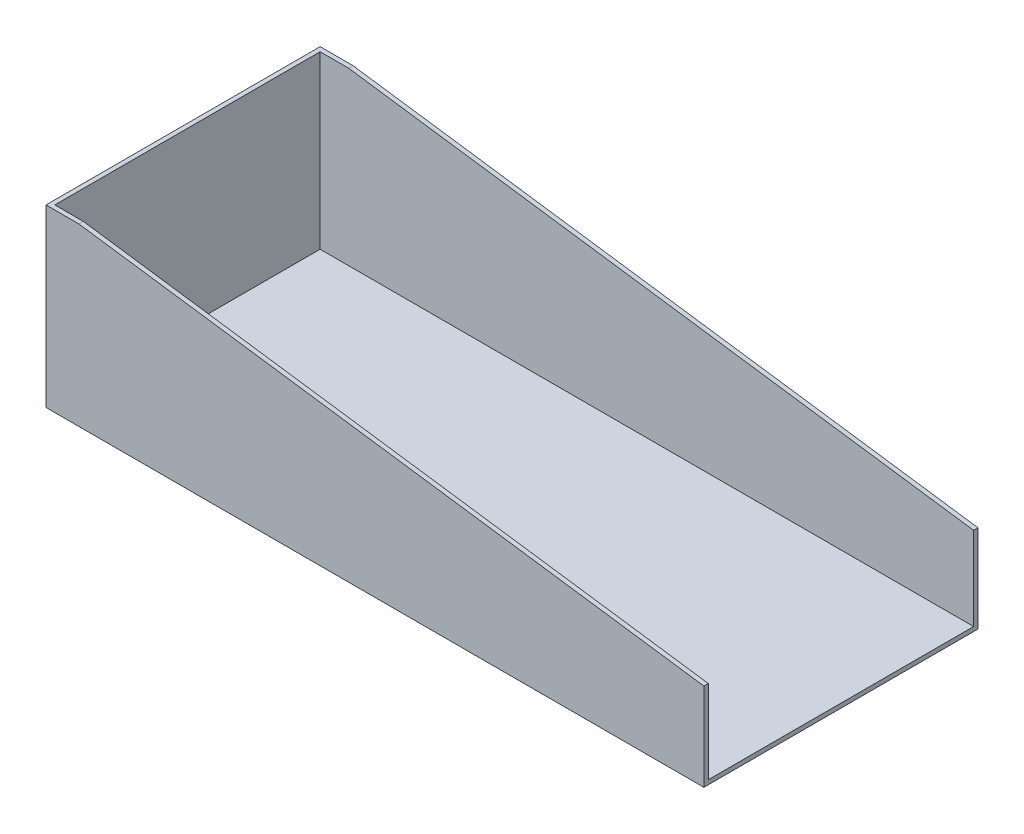
ISO-10303-21;
HEADER;
FILE_DESCRIPTION(('STEP AP214'),'2;1');
FILE_NAME('part.step','',(''),(''),'','','');
FILE_SCHEMA(('AUTOMOTIVE_DESIGN { 1 0 10303 214 1 1 1 1 }'));
ENDSEC;
DATA;
#1=APPLICATION_CONTEXT('core data for automotive mechanical design processes');
#2=APPLICATION_PROTOCOL_DEFINITION('international standard','automotive_design',2000,#1);
#3=PRODUCT_CONTEXT('',#1,'mechanical');
#4=PRODUCT('Part','Part','',(#3));
#5=PRODUCT_RELATED_PRODUCT_CATEGORY('part','',(#4));
#6=PRODUCT_DEFINITION_FORMATION('','',#4);
#7=PRODUCT_DEFINITION_CONTEXT('part definition',#1,'design');
#8=PRODUCT_DEFINITION('design','',#6,#7);
#9=PRODUCT_DEFINITION_SHAPE('','',#8);
#10=(LENGTH_UNIT() NAMED_UNIT(*) SI_UNIT(.MILLI.,.METRE.));
#11=(NAMED_UNIT(*) PLANE_ANGLE_UNIT() SI_UNIT($,.RADIAN.));
#12=(NAMED_UNIT(*) SI_UNIT($,.STERADIAN.) SOLID_ANGLE_UNIT());
#13=UNCERTAINTY_MEASURE_WITH_UNIT(LENGTH_MEASURE(1.E-05),#10,'distance_accuracy_value','');
#14=(GEOMETRIC_REPRESENTATION_CONTEXT(3) GLOBAL_UNCERTAINTY_ASSIGNED_CONTEXT((#13)) GLOBAL_UNIT_ASSIGNED_CONTEXT((#10,
#11,#12)) REPRESENTATION_CONTEXT('',''));
#15=CARTESIAN_POINT('',(0.,0.,0.));
#16=DIRECTION('',(0.,0.,1.));
#17=DIRECTION('',(1.,0.,0.));
#18=AXIS2_PLACEMENT_3D('',#15,#16,#17);
#19=CARTESIAN_POINT('',(5.50558406278298,39.2272864473287,-135.));
#20=DIRECTION('',(-0.138988628372189,-0.990293977151844,0.));
#21=DIRECTION('',(0.990293977151845,-0.138988628372189,0.));
#22=AXIS2_PLACEMENT_3D('',#19,#20,#21);
#23=PLANE('',#22);
#24=DIRECTION('',(0.990293977151845,-0.138988628372189,0.));
#25=VECTOR('',#24,1.);
#26=CARTESIAN_POINT('',(5.50558406278299,39.2272864473287,-2.));
#27=LINE('',#26,#25);
#28=CARTESIAN_POINT('',(-285.,80.,-1.99999999999997));
#29=VERTEX_POINT('',#28);
#30=CARTESIAN_POINT('',(0.,40.,-2.));
#31=VERTEX_POINT('',#30);
#32=EDGE_CURVE('E146',#29,#31,#27,.T.);
#33=ORIENTED_EDGE('',*,*,#32,.F.);
#34=DIRECTION('',(0.,0.,1.));
#35=VECTOR('',#34,1.);
#36=CARTESIAN_POINT('',(-285.,80.,0.));
#37=LINE('',#36,#35);
#38=CARTESIAN_POINT('',(-285.,80.,0.));
#39=VERTEX_POINT('',#38);
#40=EDGE_CURVE('E45',#29,#39,#37,.T.);
#41=ORIENTED_EDGE('',*,*,#40,.T.);
#42=DIRECTION('',(0.990293977151844,-0.138988628372189,0.));
#43=VECTOR('',#42,1.);
#44=CARTESIAN_POINT('',(5.50558406278298,39.2272864473287,0.));
#45=LINE('',#44,#43);
#46=CARTESIAN_POINT('',(0.,40.,0.));
#47=VERTEX_POINT('',#46);
#48=EDGE_CURVE('E152',#39,#47,#45,.T.);
#49=ORIENTED_EDGE('',*,*,#48,.T.);
#50=DIRECTION('',(0.,0.,1.));
#51=VECTOR('',#50,1.);
#52=CARTESIAN_POINT('',(0.,40.,-135.));
#53=LINE('',#52,#51);
#54=EDGE_CURVE('E156',#31,#47,#53,.T.);
#55=ORIENTED_EDGE('',*,*,#54,.F.);
#56=EDGE_LOOP('',(#33,#41,#49,#55));
#57=FACE_BOUND('',#56,.T.);
#58=ADVANCED_FACE('F37',(#57),#23,.F.);
#59=CARTESIAN_POINT('',(0.,80.,0.));
#60=DIRECTION('',(-1.,0.,0.));
#61=DIRECTION('',(0.,0.,1.));
#62=AXIS2_PLACEMENT_3D('',#59,#60,#61);
#63=PLANE('',#62);
#64=CARTESIAN_POINT('',(0.,40.,-125.));
#65=VERTEX_POINT('',#64);
#66=CARTESIAN_POINT('',(0.,40.,-123.));
#67=VERTEX_POINT('',#66);
#68=EDGE_CURVE('E157',#65,#67,#53,.T.);
#69=ORIENTED_EDGE('',*,*,#68,.T.);
#70=DIRECTION('',(0.,-1.,0.));
#71=VECTOR('',#70,1.);
#72=CARTESIAN_POINT('',(0.,80.,-123.));
#73=LINE('',#72,#71);
#74=CARTESIAN_POINT('',(0.,2.,-123.));
#75=VERTEX_POINT('',#74);
#76=EDGE_CURVE('E52',#67,#75,#73,.T.);
#77=ORIENTED_EDGE('',*,*,#76,.T.);
#78=DIRECTION('',(0.,0.,-1.));
#79=VECTOR('',#78,1.);
#80=CARTESIAN_POINT('',(0.,2.,0.));
#81=LINE('',#80,#79);
#82=CARTESIAN_POINT('',(0.,2.,-2.));
#83=VERTEX_POINT('',#82);
#84=EDGE_CURVE('E121',#83,#75,#81,.T.);
#85=ORIENTED_EDGE('',*,*,#84,.F.);
#86=DIRECTION('',(0.,-1.,0.));
#87=VECTOR('',#86,1.);
#88=CARTESIAN_POINT('',(0.,80.,-2.));
#89=LINE('',#88,#87);
#90=EDGE_CURVE('E139',#31,#83,#89,.T.);
#91=ORIENTED_EDGE('',*,*,#90,.F.);
#92=ORIENTED_EDGE('',*,*,#54,.T.);
#93=DIRECTION('',(0.,-1.,0.));
#94=VECTOR('',#93,1.);
#95=CARTESIAN_POINT('',(0.,80.,0.));
#96=LINE('',#95,#94);
#97=CARTESIAN_POINT('',(0.,0.,0.));
#98=VERTEX_POINT('',#97);
#99=EDGE_CURVE('E170',#47,#98,#96,.T.);
#100=ORIENTED_EDGE('',*,*,#99,.T.);
#101=DIRECTION('',(0.,0.,-1.));
#102=VECTOR('',#101,1.);
#103=CARTESIAN_POINT('',(0.,0.,0.));
#104=LINE('',#103,#102);
#105=CARTESIAN_POINT('',(0.,0.,-125.));
#106=VERTEX_POINT('',#105);
#107=EDGE_CURVE('E161',#98,#106,#104,.T.);
#108=ORIENTED_EDGE('',*,*,#107,.T.);
#109=DIRECTION('',(0.,-1.,0.));
#110=VECTOR('',#109,1.);
#111=CARTESIAN_POINT('',(0.,80.,-125.));
#112=LINE('',#111,#110);
#113=EDGE_CURVE('E185',#65,#106,#112,.T.);
#114=ORIENTED_EDGE('',*,*,#113,.F.);
#115=EDGE_LOOP('',(#69,#77,#85,#91,#92,#100,#108,#114));
#116=FACE_BOUND('',#115,.T.);
#117=ADVANCED_FACE('F39',(#116),#63,.F.);
#118=CARTESIAN_POINT('',(0.,80.,-125.));
#119=DIRECTION('',(0.,0.,1.));
#120=DIRECTION('',(1.,0.,0.));
#121=AXIS2_PLACEMENT_3D('',#118,#119,#120);
#122=PLANE('',#121);
#123=DIRECTION('',(-1.,0.,0.));
#124=VECTOR('',#123,1.);
#125=CARTESIAN_POINT('',(0.,80.,-125.));
#126=LINE('',#125,#124);
#127=CARTESIAN_POINT('',(-285.,80.,-125.));
#128=VERTEX_POINT('',#127);
#129=CARTESIAN_POINT('',(-300.,80.,-125.));
#130=VERTEX_POINT('',#129);
#131=EDGE_CURVE('E162',#128,#130,#126,.T.);
#132=ORIENTED_EDGE('',*,*,#131,.F.);
#133=DIRECTION('',(0.990293977151845,-0.138988628372189,0.));
#134=VECTOR('',#133,1.);
#135=CARTESIAN_POINT('',(-5.50558406278298,40.7727135526713,-125.));
#136=LINE('',#135,#134);
#137=EDGE_CURVE('E59',#128,#65,#136,.T.);
#138=ORIENTED_EDGE('',*,*,#137,.T.);
#139=ORIENTED_EDGE('',*,*,#113,.T.);
#140=DIRECTION('',(-1.,0.,0.));
#141=VECTOR('',#140,1.);
#142=CARTESIAN_POINT('',(0.,0.,-125.));
#143=LINE('',#142,#141);
#144=CARTESIAN_POINT('',(-300.,0.,-125.));
#145=VERTEX_POINT('',#144);
#146=EDGE_CURVE('E173',#106,#145,#143,.T.);
#147=ORIENTED_EDGE('',*,*,#146,.T.);
#148=DIRECTION('',(0.,-1.,0.));
#149=VECTOR('',#148,1.);
#150=CARTESIAN_POINT('',(-300.,80.,-125.));
#151=LINE('',#150,#149);
#152=EDGE_CURVE('E183',#130,#145,#151,.T.);
#153=ORIENTED_EDGE('',*,*,#152,.F.);
#154=EDGE_LOOP('',(#132,#138,#139,#147,#153));
#155=FACE_BOUND('',#154,.T.);
#156=ADVANCED_FACE('F217',(#155),#122,.F.);
#157=CARTESIAN_POINT('',(-300.,80.,0.));
#158=DIRECTION('',(1.,0.,0.));
#159=DIRECTION('',(0.,0.,-1.));
#160=AXIS2_PLACEMENT_3D('',#157,#158,#159);
#161=PLANE('',#160);
#162=DIRECTION('',(0.,0.,1.));
#163=VECTOR('',#162,1.);
#164=CARTESIAN_POINT('',(-300.,0.,0.));
#165=LINE('',#164,#163);
#166=CARTESIAN_POINT('',(-300.,0.,0.));
#167=VERTEX_POINT('',#166);
#168=EDGE_CURVE('E175',#145,#167,#165,.T.);
#169=ORIENTED_EDGE('',*,*,#168,.T.);
#170=DIRECTION('',(0.,-1.,0.));
#171=VECTOR('',#170,1.);
#172=CARTESIAN_POINT('',(-300.,80.,0.));
#173=LINE('',#172,#171);
#174=CARTESIAN_POINT('',(-300.,80.,0.));
#175=VERTEX_POINT('',#174);
#176=EDGE_CURVE('E180',#175,#167,#173,.T.);
#177=ORIENTED_EDGE('',*,*,#176,.F.);
#178=DIRECTION('',(0.,0.,1.));
#179=VECTOR('',#178,1.);
#180=CARTESIAN_POINT('',(-300.,80.,0.));
#181=LINE('',#180,#179);
#182=EDGE_CURVE('E164',#130,#175,#181,.T.);
#183=ORIENTED_EDGE('',*,*,#182,.F.);
#184=ORIENTED_EDGE('',*,*,#152,.T.);
#185=EDGE_LOOP('',(#169,#177,#183,#184));
#186=FACE_BOUND('',#185,.T.);
#187=ADVANCED_FACE('F206',(#186),#161,.F.);
#188=CARTESIAN_POINT('',(0.,80.,0.));
#189=DIRECTION('',(0.,0.,-1.));
#190=DIRECTION('',(-1.,0.,0.));
#191=AXIS2_PLACEMENT_3D('',#188,#189,#190);
#192=PLANE('',#191);
#193=ORIENTED_EDGE('',*,*,#99,.F.);
#194=ORIENTED_EDGE('',*,*,#48,.F.);
#195=DIRECTION('',(1.,0.,0.));
#196=VECTOR('',#195,1.);
#197=CARTESIAN_POINT('',(0.,80.,0.));
#198=LINE('',#197,#196);
#199=EDGE_CURVE('E167',#175,#39,#198,.T.);
#200=ORIENTED_EDGE('',*,*,#199,.F.);
#201=ORIENTED_EDGE('',*,*,#176,.T.);
#202=DIRECTION('',(1.,0.,0.));
#203=VECTOR('',#202,1.);
#204=CARTESIAN_POINT('',(0.,0.,0.));
#205=LINE('',#204,#203);
#206=EDGE_CURVE('E165',#167,#98,#205,.T.);
#207=ORIENTED_EDGE('',*,*,#206,.T.);
#208=EDGE_LOOP('',(#193,#194,#200,#201,#207));
#209=FACE_BOUND('',#208,.T.);
#210=ADVANCED_FACE('F199',(#209),#192,.F.);
#211=CARTESIAN_POINT('',(0.,80.,0.));
#212=DIRECTION('',(0.,1.,0.));
#213=DIRECTION('',(0.,0.,1.));
#214=AXIS2_PLACEMENT_3D('',#211,#212,#213);
#215=PLANE('',#214);
#216=DIRECTION('',(-1.,0.,0.));
#217=VECTOR('',#216,1.);
#218=CARTESIAN_POINT('',(0.,80.,-123.));
#219=LINE('',#218,#217);
#220=CARTESIAN_POINT('',(-285.,80.,-123.));
#221=VERTEX_POINT('',#220);
#222=CARTESIAN_POINT('',(-298.,80.,-123.));
#223=VERTEX_POINT('',#222);
#224=EDGE_CURVE('E127',#221,#223,#219,.T.);
#225=ORIENTED_EDGE('',*,*,#224,.F.);
#226=EDGE_CURVE('E11',#128,#221,#37,.T.);
#227=ORIENTED_EDGE('',*,*,#226,.F.);
#228=ORIENTED_EDGE('',*,*,#131,.T.);
#229=ORIENTED_EDGE('',*,*,#182,.T.);
#230=ORIENTED_EDGE('',*,*,#199,.T.);
#231=ORIENTED_EDGE('',*,*,#40,.F.);
#232=DIRECTION('',(1.,0.,0.));
#233=VECTOR('',#232,1.);
#234=CARTESIAN_POINT('',(0.,80.,-2.));
#235=LINE('',#234,#233);
#236=CARTESIAN_POINT('',(-298.,80.,-1.99999999999996));
#237=VERTEX_POINT('',#236);
#238=EDGE_CURVE('E144',#237,#29,#235,.T.);
#239=ORIENTED_EDGE('',*,*,#238,.F.);
#240=DIRECTION('',(0.,0.,1.));
#241=VECTOR('',#240,1.);
#242=CARTESIAN_POINT('',(-298.,80.,0.));
#243=LINE('',#242,#241);
#244=EDGE_CURVE('E142',#223,#237,#243,.T.);
#245=ORIENTED_EDGE('',*,*,#244,.F.);
#246=EDGE_LOOP('',(#225,#227,#228,#229,#230,#231,#239,#245));
#247=FACE_BOUND('',#246,.T.);
#248=ADVANCED_FACE('F200',(#247),#215,.T.);
#249=CARTESIAN_POINT('',(0.,0.,0.));
#250=DIRECTION('',(0.,1.,0.));
#251=DIRECTION('',(0.,0.,1.));
#252=AXIS2_PLACEMENT_3D('',#249,#250,#251);
#253=PLANE('',#252);
#254=ORIENTED_EDGE('',*,*,#107,.F.);
#255=ORIENTED_EDGE('',*,*,#206,.F.);
#256=ORIENTED_EDGE('',*,*,#168,.F.);
#257=ORIENTED_EDGE('',*,*,#146,.F.);
#258=EDGE_LOOP('',(#254,#255,#256,#257));
#259=FACE_BOUND('',#258,.T.);
#260=ADVANCED_FACE('F211',(#259),#253,.F.);
#261=ORIENTED_EDGE('',*,*,#226,.T.);
#262=DIRECTION('',(0.990293977151845,-0.138988628372189,0.));
#263=VECTOR('',#262,1.);
#264=CARTESIAN_POINT('',(-5.50558406278298,40.7727135526713,-123.));
#265=LINE('',#264,#263);
#266=EDGE_CURVE('E148',#221,#67,#265,.T.);
#267=ORIENTED_EDGE('',*,*,#266,.T.);
#268=ORIENTED_EDGE('',*,*,#68,.F.);
#269=ORIENTED_EDGE('',*,*,#137,.F.);
#270=EDGE_LOOP('',(#261,#267,#268,#269));
#271=FACE_BOUND('',#270,.T.);
#272=ADVANCED_FACE('F216',(#271),#23,.F.);
#273=CARTESIAN_POINT('',(0.,80.,-123.));
#274=DIRECTION('',(0.,0.,1.));
#275=DIRECTION('',(1.,0.,0.));
#276=AXIS2_PLACEMENT_3D('',#273,#274,#275);
#277=PLANE('',#276);
#278=ORIENTED_EDGE('',*,*,#224,.T.);
#279=DIRECTION('',(0.,-1.,0.));
#280=VECTOR('',#279,1.);
#281=CARTESIAN_POINT('',(-298.,80.,-123.));
#282=LINE('',#281,#280);
#283=CARTESIAN_POINT('',(-298.,2.,-123.));
#284=VERTEX_POINT('',#283);
#285=EDGE_CURVE('E124',#223,#284,#282,.T.);
#286=ORIENTED_EDGE('',*,*,#285,.T.);
#287=DIRECTION('',(-1.,0.,0.));
#288=VECTOR('',#287,1.);
#289=CARTESIAN_POINT('',(0.,2.,-123.));
#290=LINE('',#289,#288);
#291=EDGE_CURVE('E113',#75,#284,#290,.T.);
#292=ORIENTED_EDGE('',*,*,#291,.F.);
#293=ORIENTED_EDGE('',*,*,#76,.F.);
#294=ORIENTED_EDGE('',*,*,#266,.F.);
#295=EDGE_LOOP('',(#278,#286,#292,#293,#294));
#296=FACE_BOUND('',#295,.T.);
#297=ADVANCED_FACE('F125',(#296),#277,.T.);
#298=CARTESIAN_POINT('',(-298.,80.,0.));
#299=DIRECTION('',(1.,0.,0.));
#300=DIRECTION('',(0.,0.,-1.));
#301=AXIS2_PLACEMENT_3D('',#298,#299,#300);
#302=PLANE('',#301);
#303=DIRECTION('',(0.,0.,1.));
#304=VECTOR('',#303,1.);
#305=CARTESIAN_POINT('',(-298.,2.,0.));
#306=LINE('',#305,#304);
#307=CARTESIAN_POINT('',(-298.,2.,-1.99999999999996));
#308=VERTEX_POINT('',#307);
#309=EDGE_CURVE('E118',#284,#308,#306,.T.);
#310=ORIENTED_EDGE('',*,*,#309,.F.);
#311=ORIENTED_EDGE('',*,*,#285,.F.);
#312=ORIENTED_EDGE('',*,*,#244,.T.);
#313=DIRECTION('',(0.,-1.,0.));
#314=VECTOR('',#313,1.);
#315=CARTESIAN_POINT('',(-298.,80.,-1.99999999999996));
#316=LINE('',#315,#314);
#317=EDGE_CURVE('E130',#237,#308,#316,.T.);
#318=ORIENTED_EDGE('',*,*,#317,.T.);
#319=EDGE_LOOP('',(#310,#311,#312,#318));
#320=FACE_BOUND('',#319,.T.);
#321=ADVANCED_FACE('F132',(#320),#302,.T.);
#322=CARTESIAN_POINT('',(0.,80.,-2.));
#323=DIRECTION('',(0.,0.,-1.));
#324=DIRECTION('',(-1.,0.,0.));
#325=AXIS2_PLACEMENT_3D('',#322,#323,#324);
#326=PLANE('',#325);
#327=ORIENTED_EDGE('',*,*,#90,.T.);
#328=DIRECTION('',(1.,0.,0.));
#329=VECTOR('',#328,1.);
#330=CARTESIAN_POINT('',(0.,2.,-2.));
#331=LINE('',#330,#329);
#332=EDGE_CURVE('E135',#308,#83,#331,.T.);
#333=ORIENTED_EDGE('',*,*,#332,.F.);
#334=ORIENTED_EDGE('',*,*,#317,.F.);
#335=ORIENTED_EDGE('',*,*,#238,.T.);
#336=ORIENTED_EDGE('',*,*,#32,.T.);
#337=EDGE_LOOP('',(#327,#333,#334,#335,#336));
#338=FACE_BOUND('',#337,.T.);
#339=ADVANCED_FACE('F215',(#338),#326,.T.);
#340=CARTESIAN_POINT('',(0.,2.,0.));
#341=DIRECTION('',(0.,1.,0.));
#342=DIRECTION('',(0.,0.,1.));
#343=AXIS2_PLACEMENT_3D('',#340,#341,#342);
#344=PLANE('',#343);
#345=ORIENTED_EDGE('',*,*,#84,.T.);
#346=ORIENTED_EDGE('',*,*,#291,.T.);
#347=ORIENTED_EDGE('',*,*,#309,.T.);
#348=ORIENTED_EDGE('',*,*,#332,.T.);
#349=EDGE_LOOP('',(#345,#346,#347,#348));
#350=FACE_BOUND('',#349,.T.);
#351=ADVANCED_FACE('F115',(#350),#344,.T.);
#352=CLOSED_SHELL('',(#58,#117,#156,#187,#210,#248,#260,#272,#297,#321,#339,#351));
#353=MANIFOLD_SOLID_BREP('B2',#352);
#354=ADVANCED_BREP_SHAPE_REPRESENTATION('',(#18,#353),#14);
#355=SHAPE_DEFINITION_REPRESENTATION(#9,#354);
ENDSEC;
END-ISO-10303-21;
